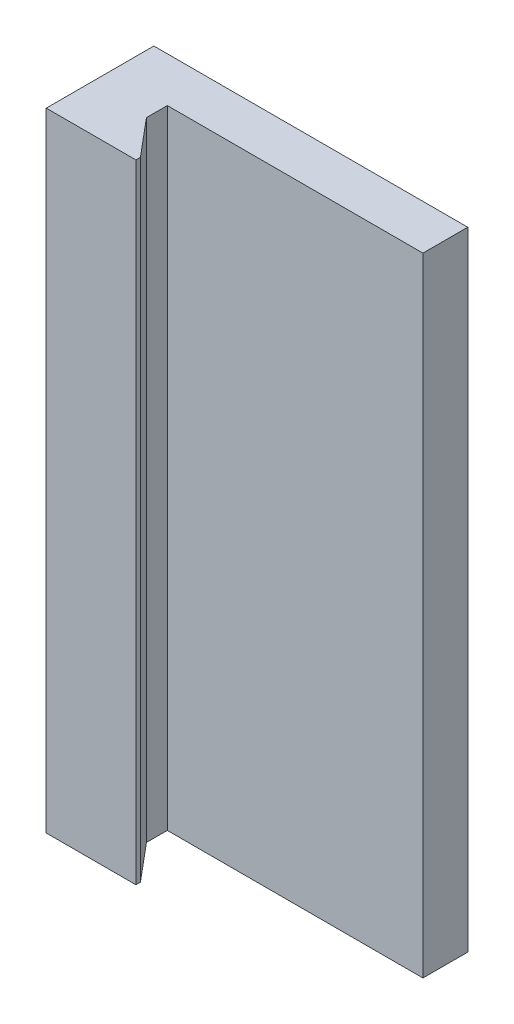
ISO-10303-21;
HEADER;
FILE_DESCRIPTION(('STEP AP214'),'2;1');
FILE_NAME('part.step','',(''),(''),'','','');
FILE_SCHEMA(('AUTOMOTIVE_DESIGN { 1 0 10303 214 1 1 1 1 }'));
ENDSEC;
DATA;
#1=APPLICATION_CONTEXT('core data for automotive mechanical design processes');
#2=APPLICATION_PROTOCOL_DEFINITION('international standard','automotive_design',2000,#1);
#3=PRODUCT_CONTEXT('',#1,'mechanical');
#4=PRODUCT('Part','Part','',(#3));
#5=PRODUCT_RELATED_PRODUCT_CATEGORY('part','',(#4));
#6=PRODUCT_DEFINITION_FORMATION('','',#4);
#7=PRODUCT_DEFINITION_CONTEXT('part definition',#1,'design');
#8=PRODUCT_DEFINITION('design','',#6,#7);
#9=PRODUCT_DEFINITION_SHAPE('','',#8);
#10=(LENGTH_UNIT() NAMED_UNIT(*) SI_UNIT(.MILLI.,.METRE.));
#11=(NAMED_UNIT(*) PLANE_ANGLE_UNIT() SI_UNIT($,.RADIAN.));
#12=(NAMED_UNIT(*) SI_UNIT($,.STERADIAN.) SOLID_ANGLE_UNIT());
#13=UNCERTAINTY_MEASURE_WITH_UNIT(LENGTH_MEASURE(1.E-05),#10,'distance_accuracy_value','');
#14=(GEOMETRIC_REPRESENTATION_CONTEXT(3) GLOBAL_UNCERTAINTY_ASSIGNED_CONTEXT((#13)) GLOBAL_UNIT_ASSIGNED_CONTEXT((#10,
#11,#12)) REPRESENTATION_CONTEXT('',''));
#15=CARTESIAN_POINT('',(0.,0.,0.));
#16=DIRECTION('',(0.,0.,1.));
#17=DIRECTION('',(1.,0.,0.));
#18=AXIS2_PLACEMENT_3D('',#15,#16,#17);
#19=CARTESIAN_POINT('',(0.,0.,12.));
#20=DIRECTION('',(1.,0.,0.));
#21=DIRECTION('',(0.,0.,-1.));
#22=AXIS2_PLACEMENT_3D('',#19,#20,#21);
#23=PLANE('',#22);
#24=DIRECTION('',(0.,-1.,0.));
#25=VECTOR('',#24,1.);
#26=CARTESIAN_POINT('',(0.,0.,0.));
#27=LINE('',#26,#25);
#28=CARTESIAN_POINT('',(0.,0.,0.));
#29=VERTEX_POINT('',#28);
#30=CARTESIAN_POINT('',(0.,-70.,0.));
#31=VERTEX_POINT('',#30);
#32=EDGE_CURVE('E97',#29,#31,#27,.T.);
#33=ORIENTED_EDGE('',*,*,#32,.T.);
#34=DIRECTION('',(0.,0.,-1.));
#35=VECTOR('',#34,1.);
#36=CARTESIAN_POINT('',(0.,-70.,12.));
#37=LINE('',#36,#35);
#38=CARTESIAN_POINT('',(0.,-70.,12.));
#39=VERTEX_POINT('',#38);
#40=EDGE_CURVE('E11',#39,#31,#37,.T.);
#41=ORIENTED_EDGE('',*,*,#40,.F.);
#42=DIRECTION('',(0.,-1.,0.));
#43=VECTOR('',#42,1.);
#44=CARTESIAN_POINT('',(0.,0.,12.));
#45=LINE('',#44,#43);
#46=CARTESIAN_POINT('',(0.,0.,12.));
#47=VERTEX_POINT('',#46);
#48=EDGE_CURVE('E91',#47,#39,#45,.T.);
#49=ORIENTED_EDGE('',*,*,#48,.F.);
#50=DIRECTION('',(0.,0.,-1.));
#51=VECTOR('',#50,1.);
#52=CARTESIAN_POINT('',(0.,0.,12.));
#53=LINE('',#52,#51);
#54=EDGE_CURVE('E82',#47,#29,#53,.T.);
#55=ORIENTED_EDGE('',*,*,#54,.T.);
#56=EDGE_LOOP('',(#33,#41,#49,#55));
#57=FACE_BOUND('',#56,.T.);
#58=ADVANCED_FACE('F37',(#57),#23,.F.);
#59=CARTESIAN_POINT('',(0.,-70.,12.));
#60=DIRECTION('',(0.,1.,0.));
#61=DIRECTION('',(0.,0.,1.));
#62=AXIS2_PLACEMENT_3D('',#59,#60,#61);
#63=PLANE('',#62);
#64=DIRECTION('',(0.,0.,-1.));
#65=VECTOR('',#64,1.);
#66=CARTESIAN_POINT('',(35.,-70.,12.));
#67=LINE('',#66,#65);
#68=CARTESIAN_POINT('',(35.,-70.,5.));
#69=VERTEX_POINT('',#68);
#70=CARTESIAN_POINT('',(35.,-70.,0.));
#71=VERTEX_POINT('',#70);
#72=EDGE_CURVE('E44',#69,#71,#67,.T.);
#73=ORIENTED_EDGE('',*,*,#72,.F.);
#74=DIRECTION('',(1.,0.,0.));
#75=VECTOR('',#74,1.);
#76=CARTESIAN_POINT('',(6.5,-70.,5.));
#77=LINE('',#76,#75);
#78=CARTESIAN_POINT('',(6.5,-70.,5.));
#79=VERTEX_POINT('',#78);
#80=EDGE_CURVE('E132',#79,#69,#77,.T.);
#81=ORIENTED_EDGE('',*,*,#80,.F.);
#82=DIRECTION('',(0.,0.,-1.));
#83=VECTOR('',#82,1.);
#84=CARTESIAN_POINT('',(6.5,-70.,7.32886242592028));
#85=LINE('',#84,#83);
#86=CARTESIAN_POINT('',(6.5,-70.,7.32886242592028));
#87=VERTEX_POINT('',#86);
#88=EDGE_CURVE('E144',#87,#79,#85,.T.);
#89=ORIENTED_EDGE('',*,*,#88,.F.);
#90=DIRECTION('',(-0.64278760968654,0.,-0.766044443118977));
#91=VECTOR('',#90,1.);
#92=CARTESIAN_POINT('',(10.,-70.,11.5));
#93=LINE('',#92,#91);
#94=CARTESIAN_POINT('',(10.,-70.,11.5));
#95=VERTEX_POINT('',#94);
#96=EDGE_CURVE('E147',#95,#87,#93,.T.);
#97=ORIENTED_EDGE('',*,*,#96,.F.);
#98=DIRECTION('',(0.,0.,-1.));
#99=VECTOR('',#98,1.);
#100=CARTESIAN_POINT('',(10.,-70.,12.));
#101=LINE('',#100,#99);
#102=CARTESIAN_POINT('',(10.,-70.,12.));
#103=VERTEX_POINT('',#102);
#104=EDGE_CURVE('E125',#103,#95,#101,.T.);
#105=ORIENTED_EDGE('',*,*,#104,.F.);
#106=DIRECTION('',(1.,0.,0.));
#107=VECTOR('',#106,1.);
#108=CARTESIAN_POINT('',(0.,-70.,12.));
#109=LINE('',#108,#107);
#110=EDGE_CURVE('E121',#39,#103,#109,.T.);
#111=ORIENTED_EDGE('',*,*,#110,.F.);
#112=ORIENTED_EDGE('',*,*,#40,.T.);
#113=DIRECTION('',(1.,0.,0.));
#114=VECTOR('',#113,1.);
#115=CARTESIAN_POINT('',(0.,-70.,0.));
#116=LINE('',#115,#114);
#117=EDGE_CURVE('E101',#31,#71,#116,.T.);
#118=ORIENTED_EDGE('',*,*,#117,.T.);
#119=EDGE_LOOP('',(#73,#81,#89,#97,#105,#111,#112,#118));
#120=FACE_BOUND('',#119,.T.);
#121=ADVANCED_FACE('F118',(#120),#63,.F.);
#122=CARTESIAN_POINT('',(35.,0.,12.));
#123=DIRECTION('',(-1.,0.,0.));
#124=DIRECTION('',(0.,0.,1.));
#125=AXIS2_PLACEMENT_3D('',#122,#123,#124);
#126=PLANE('',#125);
#127=DIRECTION('',(0.,0.,-1.));
#128=VECTOR('',#127,1.);
#129=CARTESIAN_POINT('',(35.,0.,12.));
#130=LINE('',#129,#128);
#131=CARTESIAN_POINT('',(35.,0.,5.));
#132=VERTEX_POINT('',#131);
#133=CARTESIAN_POINT('',(35.,0.,0.));
#134=VERTEX_POINT('',#133);
#135=EDGE_CURVE('E86',#132,#134,#130,.T.);
#136=ORIENTED_EDGE('',*,*,#135,.F.);
#137=DIRECTION('',(0.,-1.,0.));
#138=VECTOR('',#137,1.);
#139=CARTESIAN_POINT('',(35.,0.001000000000001,5.));
#140=LINE('',#139,#138);
#141=EDGE_CURVE('E104',#132,#69,#140,.T.);
#142=ORIENTED_EDGE('',*,*,#141,.T.);
#143=ORIENTED_EDGE('',*,*,#72,.T.);
#144=DIRECTION('',(0.,1.,0.));
#145=VECTOR('',#144,1.);
#146=CARTESIAN_POINT('',(35.,0.,0.));
#147=LINE('',#146,#145);
#148=EDGE_CURVE('E92',#71,#134,#147,.T.);
#149=ORIENTED_EDGE('',*,*,#148,.T.);
#150=EDGE_LOOP('',(#136,#142,#143,#149));
#151=FACE_BOUND('',#150,.T.);
#152=ADVANCED_FACE('F113',(#151),#126,.F.);
#153=CARTESIAN_POINT('',(0.,0.,12.));
#154=DIRECTION('',(0.,-1.,0.));
#155=DIRECTION('',(0.,0.,-1.));
#156=AXIS2_PLACEMENT_3D('',#153,#154,#155);
#157=PLANE('',#156);
#158=DIRECTION('',(0.,0.,1.));
#159=VECTOR('',#158,1.);
#160=CARTESIAN_POINT('',(6.5,0.,7.32886242592028));
#161=LINE('',#160,#159);
#162=CARTESIAN_POINT('',(6.5,0.,5.));
#163=VERTEX_POINT('',#162);
#164=CARTESIAN_POINT('',(6.5,0.,7.32886242592028));
#165=VERTEX_POINT('',#164);
#166=EDGE_CURVE('E154',#163,#165,#161,.T.);
#167=ORIENTED_EDGE('',*,*,#166,.F.);
#168=DIRECTION('',(-1.,0.,0.));
#169=VECTOR('',#168,1.);
#170=CARTESIAN_POINT('',(6.5,0.,5.));
#171=LINE('',#170,#169);
#172=EDGE_CURVE('E151',#132,#163,#171,.T.);
#173=ORIENTED_EDGE('',*,*,#172,.F.);
#174=ORIENTED_EDGE('',*,*,#135,.T.);
#175=DIRECTION('',(-1.,0.,0.));
#176=VECTOR('',#175,1.);
#177=CARTESIAN_POINT('',(0.,0.,0.));
#178=LINE('',#177,#176);
#179=EDGE_CURVE('E78',#134,#29,#178,.T.);
#180=ORIENTED_EDGE('',*,*,#179,.T.);
#181=ORIENTED_EDGE('',*,*,#54,.F.);
#182=DIRECTION('',(-1.,0.,0.));
#183=VECTOR('',#182,1.);
#184=CARTESIAN_POINT('',(0.,0.,12.));
#185=LINE('',#184,#183);
#186=CARTESIAN_POINT('',(10.,0.,12.));
#187=VERTEX_POINT('',#186);
#188=EDGE_CURVE('E59',#187,#47,#185,.T.);
#189=ORIENTED_EDGE('',*,*,#188,.F.);
#190=DIRECTION('',(0.,0.,1.));
#191=VECTOR('',#190,1.);
#192=CARTESIAN_POINT('',(10.,0.,12.));
#193=LINE('',#192,#191);
#194=CARTESIAN_POINT('',(10.,0.,11.5));
#195=VERTEX_POINT('',#194);
#196=EDGE_CURVE('E51',#195,#187,#193,.T.);
#197=ORIENTED_EDGE('',*,*,#196,.F.);
#198=DIRECTION('',(0.64278760968654,0.,0.766044443118977));
#199=VECTOR('',#198,1.);
#200=CARTESIAN_POINT('',(10.,0.,11.5));
#201=LINE('',#200,#199);
#202=EDGE_CURVE('E157',#165,#195,#201,.T.);
#203=ORIENTED_EDGE('',*,*,#202,.F.);
#204=EDGE_LOOP('',(#167,#173,#174,#180,#181,#189,#197,#203));
#205=FACE_BOUND('',#204,.T.);
#206=ADVANCED_FACE('F81',(#205),#157,.F.);
#207=CARTESIAN_POINT('',(0.,0.,12.));
#208=DIRECTION('',(0.,0.,1.));
#209=DIRECTION('',(1.,0.,0.));
#210=AXIS2_PLACEMENT_3D('',#207,#208,#209);
#211=PLANE('',#210);
#212=DIRECTION('',(0.,-1.,0.));
#213=VECTOR('',#212,1.);
#214=CARTESIAN_POINT('',(10.,0.001000000000001,12.));
#215=LINE('',#214,#213);
#216=EDGE_CURVE('E129',#187,#103,#215,.T.);
#217=ORIENTED_EDGE('',*,*,#216,.F.);
#218=ORIENTED_EDGE('',*,*,#188,.T.);
#219=ORIENTED_EDGE('',*,*,#48,.T.);
#220=ORIENTED_EDGE('',*,*,#110,.T.);
#221=EDGE_LOOP('',(#217,#218,#219,#220));
#222=FACE_BOUND('',#221,.T.);
#223=ADVANCED_FACE('F126',(#222),#211,.T.);
#224=CARTESIAN_POINT('',(0.,0.,0.));
#225=DIRECTION('',(0.,0.,1.));
#226=DIRECTION('',(1.,0.,0.));
#227=AXIS2_PLACEMENT_3D('',#224,#225,#226);
#228=PLANE('',#227);
#229=ORIENTED_EDGE('',*,*,#32,.F.);
#230=ORIENTED_EDGE('',*,*,#179,.F.);
#231=ORIENTED_EDGE('',*,*,#148,.F.);
#232=ORIENTED_EDGE('',*,*,#117,.F.);
#233=EDGE_LOOP('',(#229,#230,#231,#232));
#234=FACE_BOUND('',#233,.T.);
#235=ADVANCED_FACE('F99',(#234),#228,.F.);
#236=CARTESIAN_POINT('',(6.5,0.001000000000001,5.));
#237=DIRECTION('',(0.,0.,-1.));
#238=DIRECTION('',(-1.,0.,0.));
#239=AXIS2_PLACEMENT_3D('',#236,#237,#238);
#240=PLANE('',#239);
#241=ORIENTED_EDGE('',*,*,#172,.T.);
#242=DIRECTION('',(0.,-1.,0.));
#243=VECTOR('',#242,1.);
#244=CARTESIAN_POINT('',(6.5,0.001000000000001,5.));
#245=LINE('',#244,#243);
#246=EDGE_CURVE('E138',#163,#79,#245,.T.);
#247=ORIENTED_EDGE('',*,*,#246,.T.);
#248=ORIENTED_EDGE('',*,*,#80,.T.);
#249=ORIENTED_EDGE('',*,*,#141,.F.);
#250=EDGE_LOOP('',(#241,#247,#248,#249));
#251=FACE_BOUND('',#250,.T.);
#252=ADVANCED_FACE('F173',(#251),#240,.F.);
#253=CARTESIAN_POINT('',(6.5,0.001000000000001,7.32886242592028));
#254=DIRECTION('',(-1.,0.,0.));
#255=DIRECTION('',(0.,0.,1.));
#256=AXIS2_PLACEMENT_3D('',#253,#254,#255);
#257=PLANE('',#256);
#258=ORIENTED_EDGE('',*,*,#166,.T.);
#259=DIRECTION('',(0.,-1.,0.));
#260=VECTOR('',#259,1.);
#261=CARTESIAN_POINT('',(6.5,0.001000000000001,7.32886242592028));
#262=LINE('',#261,#260);
#263=EDGE_CURVE('E135',#165,#87,#262,.T.);
#264=ORIENTED_EDGE('',*,*,#263,.T.);
#265=ORIENTED_EDGE('',*,*,#88,.T.);
#266=ORIENTED_EDGE('',*,*,#246,.F.);
#267=EDGE_LOOP('',(#258,#264,#265,#266));
#268=FACE_BOUND('',#267,.T.);
#269=ADVANCED_FACE('F187',(#268),#257,.F.);
#270=CARTESIAN_POINT('',(10.,0.001000000000001,11.5));
#271=DIRECTION('',(-0.766044443118977,0.,0.64278760968654));
#272=DIRECTION('',(0.64278760968654,0.,0.766044443118977));
#273=AXIS2_PLACEMENT_3D('',#270,#271,#272);
#274=PLANE('',#273);
#275=ORIENTED_EDGE('',*,*,#202,.T.);
#276=DIRECTION('',(0.,-1.,0.));
#277=VECTOR('',#276,1.);
#278=CARTESIAN_POINT('',(10.,0.001000000000001,11.5));
#279=LINE('',#278,#277);
#280=EDGE_CURVE('E131',#195,#95,#279,.T.);
#281=ORIENTED_EDGE('',*,*,#280,.T.);
#282=ORIENTED_EDGE('',*,*,#96,.T.);
#283=ORIENTED_EDGE('',*,*,#263,.F.);
#284=EDGE_LOOP('',(#275,#281,#282,#283));
#285=FACE_BOUND('',#284,.T.);
#286=ADVANCED_FACE('F163',(#285),#274,.F.);
#287=CARTESIAN_POINT('',(10.,0.001000000000001,12.));
#288=DIRECTION('',(-1.,0.,0.));
#289=DIRECTION('',(0.,0.,1.));
#290=AXIS2_PLACEMENT_3D('',#287,#288,#289);
#291=PLANE('',#290);
#292=ORIENTED_EDGE('',*,*,#196,.T.);
#293=ORIENTED_EDGE('',*,*,#216,.T.);
#294=ORIENTED_EDGE('',*,*,#104,.T.);
#295=ORIENTED_EDGE('',*,*,#280,.F.);
#296=EDGE_LOOP('',(#292,#293,#294,#295));
#297=FACE_BOUND('',#296,.T.);
#298=ADVANCED_FACE('F181',(#297),#291,.F.);
#299=CLOSED_SHELL('',(#58,#121,#152,#206,#223,#235,#252,#269,#286,#298));
#300=MANIFOLD_SOLID_BREP('B2',#299);
#301=ADVANCED_BREP_SHAPE_REPRESENTATION('',(#18,#300),#14);
#302=SHAPE_DEFINITION_REPRESENTATION(#9,#301);
ENDSEC;
END-ISO-10303-21;
